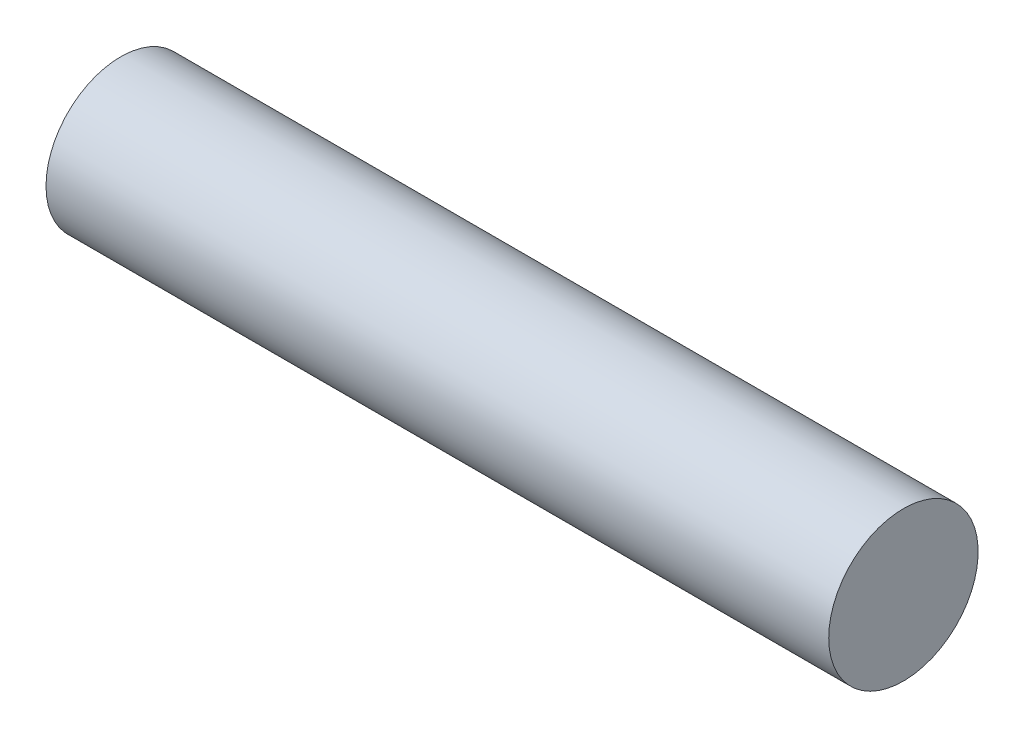
ISO-10303-21;
HEADER;
FILE_DESCRIPTION(('STEP AP214'),'2;1');
FILE_NAME('part.step','',(''),(''),'','','');
FILE_SCHEMA(('AUTOMOTIVE_DESIGN { 1 0 10303 214 1 1 1 1 }'));
ENDSEC;
DATA;
#1=APPLICATION_CONTEXT('core data for automotive mechanical design processes');
#2=APPLICATION_PROTOCOL_DEFINITION('international standard','automotive_design',2000,#1);
#3=PRODUCT_CONTEXT('',#1,'mechanical');
#4=PRODUCT('Part','Part','',(#3));
#5=PRODUCT_RELATED_PRODUCT_CATEGORY('part','',(#4));
#6=PRODUCT_DEFINITION_FORMATION('','',#4);
#7=PRODUCT_DEFINITION_CONTEXT('part definition',#1,'design');
#8=PRODUCT_DEFINITION('design','',#6,#7);
#9=PRODUCT_DEFINITION_SHAPE('','',#8);
#10=(LENGTH_UNIT() NAMED_UNIT(*) SI_UNIT(.MILLI.,.METRE.));
#11=(NAMED_UNIT(*) PLANE_ANGLE_UNIT() SI_UNIT($,.RADIAN.));
#12=(NAMED_UNIT(*) SI_UNIT($,.STERADIAN.) SOLID_ANGLE_UNIT());
#13=UNCERTAINTY_MEASURE_WITH_UNIT(LENGTH_MEASURE(1.E-05),#10,'distance_accuracy_value','');
#14=(GEOMETRIC_REPRESENTATION_CONTEXT(3) GLOBAL_UNCERTAINTY_ASSIGNED_CONTEXT((#13)) GLOBAL_UNIT_ASSIGNED_CONTEXT((#10,
#11,#12)) REPRESENTATION_CONTEXT('',''));
#15=CARTESIAN_POINT('',(0.,0.,0.));
#16=DIRECTION('',(0.,0.,1.));
#17=DIRECTION('',(1.,0.,0.));
#18=AXIS2_PLACEMENT_3D('',#15,#16,#17);
#19=CARTESIAN_POINT('',(-150.227441652337,1.05,0.));
#20=DIRECTION('',(1.,0.,0.));
#21=DIRECTION('',(0.,0.,-1.));
#22=AXIS2_PLACEMENT_3D('',#19,#20,#21);
#23=PLANE('',#22);
#24=CARTESIAN_POINT('',(-150.227441652337,0.,0.));
#25=DIRECTION('',(-1.,0.,0.));
#26=DIRECTION('',(0.,0.,1.));
#27=AXIS2_PLACEMENT_3D('',#24,#25,#26);
#28=CIRCLE('',#27,1.05);
#29=CARTESIAN_POINT('',(-150.227441652337,0.,1.05));
#30=VERTEX_POINT('',#29);
#31=EDGE_CURVE('E50',#30,#30,#28,.T.);
#32=ORIENTED_EDGE('',*,*,#31,.T.);
#33=EDGE_LOOP('',(#32));
#34=FACE_BOUND('',#33,.T.);
#35=ADVANCED_FACE('F43',(#34),#23,.F.);
#36=CARTESIAN_POINT('',(-139.227441652337,0.,0.));
#37=DIRECTION('',(-1.,0.,0.));
#38=DIRECTION('',(0.,0.,1.));
#39=AXIS2_PLACEMENT_3D('',#36,#37,#38);
#40=PLANE('',#39);
#41=CARTESIAN_POINT('',(-139.227441652337,0.,0.));
#42=DIRECTION('',(-1.,0.,0.));
#43=DIRECTION('',(0.,0.,1.));
#44=AXIS2_PLACEMENT_3D('',#41,#42,#43);
#45=CIRCLE('',#44,1.05);
#46=CARTESIAN_POINT('',(-139.227441652337,0.,1.05));
#47=VERTEX_POINT('',#46);
#48=EDGE_CURVE('E10',#47,#47,#45,.T.);
#49=ORIENTED_EDGE('',*,*,#48,.F.);
#50=EDGE_LOOP('',(#49));
#51=FACE_BOUND('',#50,.T.);
#52=ADVANCED_FACE('F60',(#51),#40,.F.);
#53=CARTESIAN_POINT('',(-150.227441652337,0.,0.));
#54=DIRECTION('',(-1.,0.,0.));
#55=DIRECTION('',(0.,0.,1.));
#56=AXIS2_PLACEMENT_3D('',#53,#54,#55);
#57=CYLINDRICAL_SURFACE('',#56,1.05);
#58=ORIENTED_EDGE('',*,*,#31,.F.);
#59=EDGE_LOOP('',(#58));
#60=FACE_BOUND('',#59,.T.);
#61=ORIENTED_EDGE('',*,*,#48,.T.);
#62=EDGE_LOOP('',(#61));
#63=FACE_BOUND('',#62,.T.);
#64=ADVANCED_FACE('F58',(#60,#63),#57,.T.);
#65=CLOSED_SHELL('',(#35,#52,#64));
#66=MANIFOLD_SOLID_BREP('B2',#65);
#67=ADVANCED_BREP_SHAPE_REPRESENTATION('',(#18,#66),#14);
#68=SHAPE_DEFINITION_REPRESENTATION(#9,#67);
ENDSEC;
END-ISO-10303-21;
